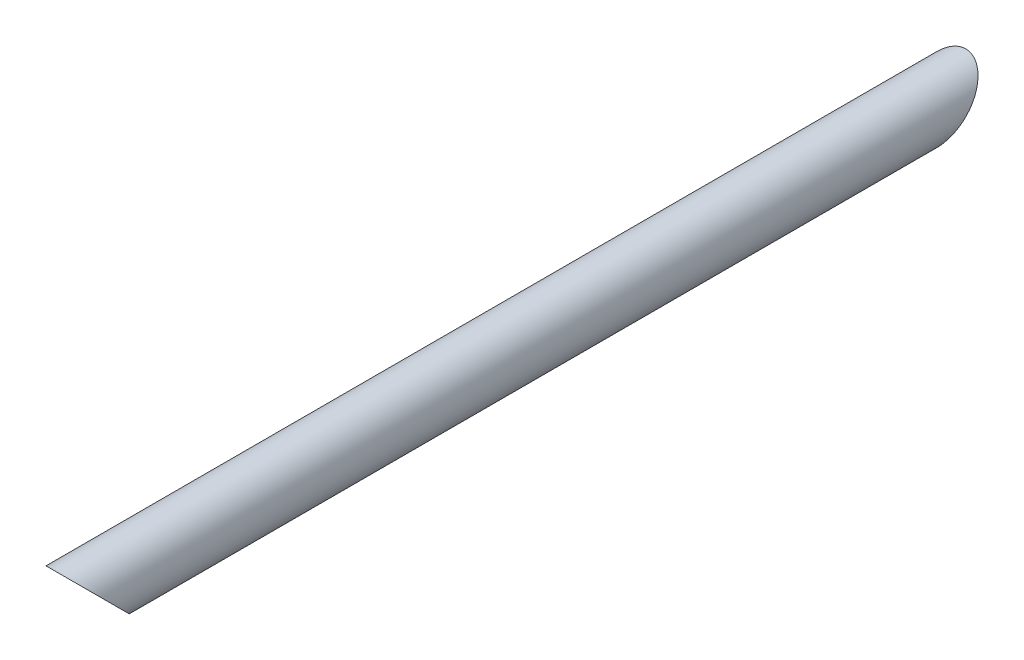
ISO-10303-21;
HEADER;
FILE_DESCRIPTION(('STEP AP214'),'2;1');
FILE_NAME('part.step','',(''),(''),'','','');
FILE_SCHEMA(('AUTOMOTIVE_DESIGN { 1 0 10303 214 1 1 1 1 }'));
ENDSEC;
DATA;
#1=APPLICATION_CONTEXT('core data for automotive mechanical design processes');
#2=APPLICATION_PROTOCOL_DEFINITION('international standard','automotive_design',2000,#1);
#3=PRODUCT_CONTEXT('',#1,'mechanical');
#4=PRODUCT('Part','Part','',(#3));
#5=PRODUCT_RELATED_PRODUCT_CATEGORY('part','',(#4));
#6=PRODUCT_DEFINITION_FORMATION('','',#4);
#7=PRODUCT_DEFINITION_CONTEXT('part definition',#1,'design');
#8=PRODUCT_DEFINITION('design','',#6,#7);
#9=PRODUCT_DEFINITION_SHAPE('','',#8);
#10=(LENGTH_UNIT() NAMED_UNIT(*) SI_UNIT(.MILLI.,.METRE.));
#11=(NAMED_UNIT(*) PLANE_ANGLE_UNIT() SI_UNIT($,.RADIAN.));
#12=(NAMED_UNIT(*) SI_UNIT($,.STERADIAN.) SOLID_ANGLE_UNIT());
#13=UNCERTAINTY_MEASURE_WITH_UNIT(LENGTH_MEASURE(1.E-05),#10,'distance_accuracy_value','');
#14=(GEOMETRIC_REPRESENTATION_CONTEXT(3) GLOBAL_UNCERTAINTY_ASSIGNED_CONTEXT((#13)) GLOBAL_UNIT_ASSIGNED_CONTEXT((#10,
#11,#12)) REPRESENTATION_CONTEXT('',''));
#15=CARTESIAN_POINT('',(0.,0.,0.));
#16=DIRECTION('',(0.,0.,1.));
#17=DIRECTION('',(1.,0.,0.));
#18=AXIS2_PLACEMENT_3D('',#15,#16,#17);
#19=CARTESIAN_POINT('',(-1.89426637461628,7.26135443602912,831.85));
#20=DIRECTION('',(0.,0.,-1.));
#21=DIRECTION('',(-1.,0.,0.));
#22=AXIS2_PLACEMENT_3D('',#19,#20,#21);
#23=CYLINDRICAL_SURFACE('',#22,26.9875);
#24=CARTESIAN_POINT('',(-1.89426637461628,7.26135443602912,26.9875000000004));
#25=DIRECTION('',(0.,0.707106781186548,0.707106781186548));
#26=DIRECTION('',(0.,0.707106781186548,-0.707106781186548));
#27=AXIS2_PLACEMENT_3D('',#24,#25,#26);
#28=ELLIPSE('',#27,38.1660885145439,26.9875);
#29=CARTESIAN_POINT('',(-1.89426637461628,34.2488544360291,3.88578058618805E-13));
#30=VERTEX_POINT('',#29);
#31=EDGE_CURVE('E47',#30,#30,#28,.T.);
#32=ORIENTED_EDGE('',*,*,#31,.T.);
#33=EDGE_LOOP('',(#32));
#34=FACE_BOUND('',#33,.T.);
#35=CARTESIAN_POINT('',(-1.89426637461628,7.26135443602912,804.8625));
#36=DIRECTION('',(0.,0.707106781186548,-0.707106781186547));
#37=DIRECTION('',(0.,-0.707106781186547,-0.707106781186548));
#38=AXIS2_PLACEMENT_3D('',#35,#36,#37);
#39=ELLIPSE('',#38,38.1660885145439,26.9875);
#40=CARTESIAN_POINT('',(-1.89426637461628,-19.7261455639709,777.875));
#41=VERTEX_POINT('',#40);
#42=EDGE_CURVE('E10',#41,#41,#39,.T.);
#43=ORIENTED_EDGE('',*,*,#42,.T.);
#44=EDGE_LOOP('',(#43));
#45=FACE_BOUND('',#44,.T.);
#46=ADVANCED_FACE('F40',(#34,#45),#23,.T.);
#47=CARTESIAN_POINT('',(-28.8817663746163,34.2488544360291,4.44089209850063E-13));
#48=DIRECTION('',(0.,0.707106781186548,0.707106781186548));
#49=DIRECTION('',(0.,-0.707106781186548,0.707106781186548));
#50=AXIS2_PLACEMENT_3D('',#47,#48,#49);
#51=PLANE('',#50);
#52=ORIENTED_EDGE('',*,*,#31,.F.);
#53=EDGE_LOOP('',(#52));
#54=FACE_BOUND('',#53,.T.);
#55=ADVANCED_FACE('F55',(#54),#51,.F.);
#56=CARTESIAN_POINT('',(-28.8817663746163,34.2488544360291,831.85));
#57=DIRECTION('',(0.,0.707106781186548,-0.707106781186547));
#58=DIRECTION('',(0.,0.707106781186547,0.707106781186548));
#59=AXIS2_PLACEMENT_3D('',#56,#57,#58);
#60=PLANE('',#59);
#61=ORIENTED_EDGE('',*,*,#42,.F.);
#62=EDGE_LOOP('',(#61));
#63=FACE_BOUND('',#62,.T.);
#64=ADVANCED_FACE('F57',(#63),#60,.F.);
#65=CLOSED_SHELL('',(#46,#55,#64));
#66=MANIFOLD_SOLID_BREP('B2',#65);
#67=ADVANCED_BREP_SHAPE_REPRESENTATION('',(#18,#66),#14);
#68=SHAPE_DEFINITION_REPRESENTATION(#9,#67);
ENDSEC;
END-ISO-10303-21;
